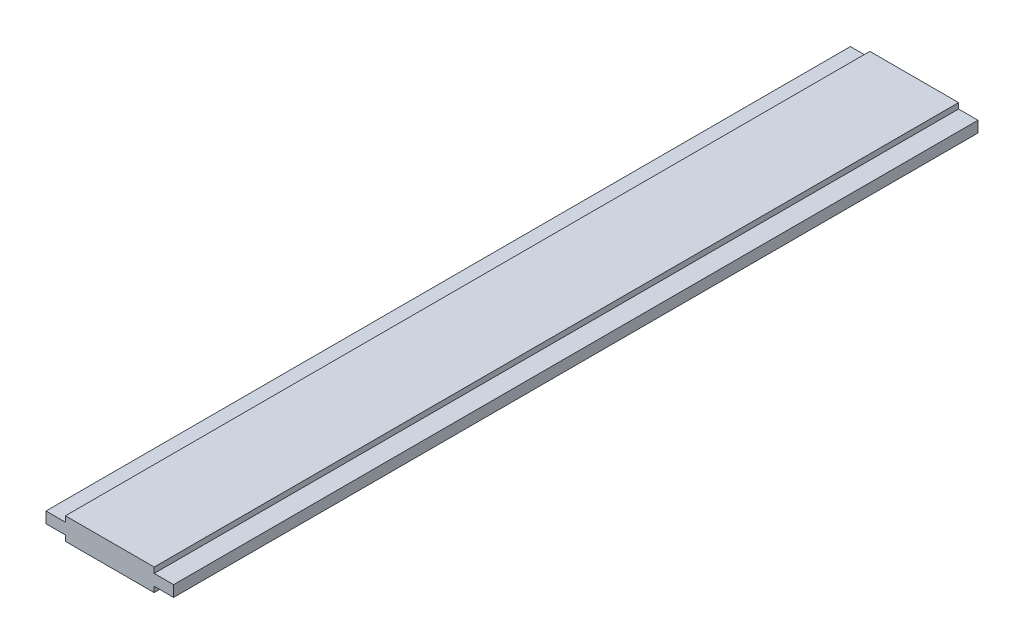
ISO-10303-21;
HEADER;
FILE_DESCRIPTION(('STEP AP214'),'2;1');
FILE_NAME('part.step','',(''),(''),'','','');
FILE_SCHEMA(('AUTOMOTIVE_DESIGN { 1 0 10303 214 1 1 1 1 }'));
ENDSEC;
DATA;
#1=APPLICATION_CONTEXT('core data for automotive mechanical design processes');
#2=APPLICATION_PROTOCOL_DEFINITION('international standard','automotive_design',2000,#1);
#3=PRODUCT_CONTEXT('',#1,'mechanical');
#4=PRODUCT('Part','Part','',(#3));
#5=PRODUCT_RELATED_PRODUCT_CATEGORY('part','',(#4));
#6=PRODUCT_DEFINITION_FORMATION('','',#4);
#7=PRODUCT_DEFINITION_CONTEXT('part definition',#1,'design');
#8=PRODUCT_DEFINITION('design','',#6,#7);
#9=PRODUCT_DEFINITION_SHAPE('','',#8);
#10=(LENGTH_UNIT() NAMED_UNIT(*) SI_UNIT(.MILLI.,.METRE.));
#11=(NAMED_UNIT(*) PLANE_ANGLE_UNIT() SI_UNIT($,.RADIAN.));
#12=(NAMED_UNIT(*) SI_UNIT($,.STERADIAN.) SOLID_ANGLE_UNIT());
#13=UNCERTAINTY_MEASURE_WITH_UNIT(LENGTH_MEASURE(1.E-05),#10,'distance_accuracy_value','');
#14=(GEOMETRIC_REPRESENTATION_CONTEXT(3) GLOBAL_UNCERTAINTY_ASSIGNED_CONTEXT((#13)) GLOBAL_UNIT_ASSIGNED_CONTEXT((#10,
#11,#12)) REPRESENTATION_CONTEXT('',''));
#15=CARTESIAN_POINT('',(0.,0.,0.));
#16=DIRECTION('',(0.,0.,1.));
#17=DIRECTION('',(1.,0.,0.));
#18=AXIS2_PLACEMENT_3D('',#15,#16,#17);
#19=CARTESIAN_POINT('',(-4.,17.5,72.5));
#20=DIRECTION('',(1.,0.,0.));
#21=DIRECTION('',(0.,1.,0.));
#22=AXIS2_PLACEMENT_3D('',#19,#20,#21);
#23=PLANE('',#22);
#24=DIRECTION('',(0.,-1.,0.));
#25=VECTOR('',#24,1.);
#26=CARTESIAN_POINT('',(-4.,17.5,0.));
#27=LINE('',#26,#25);
#28=CARTESIAN_POINT('',(-4.,17.5,0.));
#29=VERTEX_POINT('',#28);
#30=CARTESIAN_POINT('',(-4.,17.,0.));
#31=VERTEX_POINT('',#30);
#32=EDGE_CURVE('E154',#29,#31,#27,.T.);
#33=ORIENTED_EDGE('',*,*,#32,.T.);
#34=DIRECTION('',(0.,0.,-1.));
#35=VECTOR('',#34,1.);
#36=CARTESIAN_POINT('',(-4.,17.,72.5));
#37=LINE('',#36,#35);
#38=CARTESIAN_POINT('',(-4.,17.,72.5));
#39=VERTEX_POINT('',#38);
#40=EDGE_CURVE('E11',#39,#31,#37,.T.);
#41=ORIENTED_EDGE('',*,*,#40,.F.);
#42=DIRECTION('',(0.,-1.,0.));
#43=VECTOR('',#42,1.);
#44=CARTESIAN_POINT('',(-4.,17.5,72.5));
#45=LINE('',#44,#43);
#46=CARTESIAN_POINT('',(-4.,17.5,72.5));
#47=VERTEX_POINT('',#46);
#48=EDGE_CURVE('E184',#47,#39,#45,.T.);
#49=ORIENTED_EDGE('',*,*,#48,.F.);
#50=DIRECTION('',(0.,0.,-1.));
#51=VECTOR('',#50,1.);
#52=CARTESIAN_POINT('',(-4.,17.5,72.5));
#53=LINE('',#52,#51);
#54=EDGE_CURVE('E153',#47,#29,#53,.T.);
#55=ORIENTED_EDGE('',*,*,#54,.T.);
#56=EDGE_LOOP('',(#33,#41,#49,#55));
#57=FACE_BOUND('',#56,.T.);
#58=ADVANCED_FACE('F32',(#57),#23,.F.);
#59=CARTESIAN_POINT('',(-4.,17.,72.5));
#60=DIRECTION('',(0.,1.,0.));
#61=DIRECTION('',(0.,0.,1.));
#62=AXIS2_PLACEMENT_3D('',#59,#60,#61);
#63=PLANE('',#62);
#64=DIRECTION('',(1.,0.,0.));
#65=VECTOR('',#64,1.);
#66=CARTESIAN_POINT('',(-4.,17.,0.));
#67=LINE('',#66,#65);
#68=CARTESIAN_POINT('',(4.,17.,0.));
#69=VERTEX_POINT('',#68);
#70=EDGE_CURVE('E157',#31,#69,#67,.T.);
#71=ORIENTED_EDGE('',*,*,#70,.T.);
#72=DIRECTION('',(0.,0.,-1.));
#73=VECTOR('',#72,1.);
#74=CARTESIAN_POINT('',(4.,17.,72.5));
#75=LINE('',#74,#73);
#76=CARTESIAN_POINT('',(4.,17.,72.5));
#77=VERTEX_POINT('',#76);
#78=EDGE_CURVE('E40',#77,#69,#75,.T.);
#79=ORIENTED_EDGE('',*,*,#78,.F.);
#80=DIRECTION('',(1.,0.,0.));
#81=VECTOR('',#80,1.);
#82=CARTESIAN_POINT('',(-4.,17.,72.5));
#83=LINE('',#82,#81);
#84=EDGE_CURVE('E102',#39,#77,#83,.T.);
#85=ORIENTED_EDGE('',*,*,#84,.F.);
#86=ORIENTED_EDGE('',*,*,#40,.T.);
#87=EDGE_LOOP('',(#71,#79,#85,#86));
#88=FACE_BOUND('',#87,.T.);
#89=ADVANCED_FACE('F205',(#88),#63,.F.);
#90=CARTESIAN_POINT('',(4.,17.5,72.5));
#91=DIRECTION('',(1.,0.,0.));
#92=DIRECTION('',(0.,1.,0.));
#93=AXIS2_PLACEMENT_3D('',#90,#91,#92);
#94=PLANE('',#93);
#95=DIRECTION('',(0.,-1.,0.));
#96=VECTOR('',#95,1.);
#97=CARTESIAN_POINT('',(4.,17.5,0.));
#98=LINE('',#97,#96);
#99=CARTESIAN_POINT('',(4.,17.5,0.));
#100=VERTEX_POINT('',#99);
#101=EDGE_CURVE('E160',#100,#69,#98,.T.);
#102=ORIENTED_EDGE('',*,*,#101,.F.);
#103=DIRECTION('',(0.,0.,-1.));
#104=VECTOR('',#103,1.);
#105=CARTESIAN_POINT('',(4.,17.5,72.5));
#106=LINE('',#105,#104);
#107=CARTESIAN_POINT('',(4.,17.5,72.5));
#108=VERTEX_POINT('',#107);
#109=EDGE_CURVE('E198',#108,#100,#106,.T.);
#110=ORIENTED_EDGE('',*,*,#109,.F.);
#111=DIRECTION('',(0.,-1.,0.));
#112=VECTOR('',#111,1.);
#113=CARTESIAN_POINT('',(4.,17.5,72.5));
#114=LINE('',#113,#112);
#115=EDGE_CURVE('E204',#108,#77,#114,.T.);
#116=ORIENTED_EDGE('',*,*,#115,.T.);
#117=ORIENTED_EDGE('',*,*,#78,.T.);
#118=EDGE_LOOP('',(#102,#110,#116,#117));
#119=FACE_BOUND('',#118,.T.);
#120=ADVANCED_FACE('F202',(#119),#94,.T.);
#121=CARTESIAN_POINT('',(4.,17.5,72.5));
#122=DIRECTION('',(0.,1.,0.));
#123=DIRECTION('',(0.,0.,1.));
#124=AXIS2_PLACEMENT_3D('',#121,#122,#123);
#125=PLANE('',#124);
#126=DIRECTION('',(1.,0.,0.));
#127=VECTOR('',#126,1.);
#128=CARTESIAN_POINT('',(4.,17.5,0.));
#129=LINE('',#128,#127);
#130=CARTESIAN_POINT('',(5.75000000000004,17.5,0.));
#131=VERTEX_POINT('',#130);
#132=EDGE_CURVE('E163',#100,#131,#129,.T.);
#133=ORIENTED_EDGE('',*,*,#132,.T.);
#134=DIRECTION('',(0.,0.,-1.));
#135=VECTOR('',#134,1.);
#136=CARTESIAN_POINT('',(5.75000000000004,17.5,72.5));
#137=LINE('',#136,#135);
#138=CARTESIAN_POINT('',(5.75000000000004,17.5,72.5));
#139=VERTEX_POINT('',#138);
#140=EDGE_CURVE('E196',#139,#131,#137,.T.);
#141=ORIENTED_EDGE('',*,*,#140,.F.);
#142=DIRECTION('',(1.,0.,0.));
#143=VECTOR('',#142,1.);
#144=CARTESIAN_POINT('',(4.,17.5,72.5));
#145=LINE('',#144,#143);
#146=EDGE_CURVE('E217',#108,#139,#145,.T.);
#147=ORIENTED_EDGE('',*,*,#146,.F.);
#148=ORIENTED_EDGE('',*,*,#109,.T.);
#149=EDGE_LOOP('',(#133,#141,#147,#148));
#150=FACE_BOUND('',#149,.T.);
#151=ADVANCED_FACE('F214',(#150),#125,.F.);
#152=CARTESIAN_POINT('',(5.75000000000004,18.5,72.5));
#153=DIRECTION('',(1.,0.,0.));
#154=DIRECTION('',(0.,0.,-1.));
#155=AXIS2_PLACEMENT_3D('',#152,#153,#154);
#156=PLANE('',#155);
#157=DIRECTION('',(0.,-1.,0.));
#158=VECTOR('',#157,1.);
#159=CARTESIAN_POINT('',(5.75000000000004,18.5,0.));
#160=LINE('',#159,#158);
#161=CARTESIAN_POINT('',(5.75000000000004,18.5,0.));
#162=VERTEX_POINT('',#161);
#163=EDGE_CURVE('E166',#162,#131,#160,.T.);
#164=ORIENTED_EDGE('',*,*,#163,.F.);
#165=DIRECTION('',(0.,0.,-1.));
#166=VECTOR('',#165,1.);
#167=CARTESIAN_POINT('',(5.75000000000004,18.5,72.5));
#168=LINE('',#167,#166);
#169=CARTESIAN_POINT('',(5.75000000000004,18.5,72.5));
#170=VERTEX_POINT('',#169);
#171=EDGE_CURVE('E194',#170,#162,#168,.T.);
#172=ORIENTED_EDGE('',*,*,#171,.F.);
#173=DIRECTION('',(0.,-1.,0.));
#174=VECTOR('',#173,1.);
#175=CARTESIAN_POINT('',(5.75000000000004,18.5,72.5));
#176=LINE('',#175,#174);
#177=EDGE_CURVE('E219',#170,#139,#176,.T.);
#178=ORIENTED_EDGE('',*,*,#177,.T.);
#179=ORIENTED_EDGE('',*,*,#140,.T.);
#180=EDGE_LOOP('',(#164,#172,#178,#179));
#181=FACE_BOUND('',#180,.T.);
#182=ADVANCED_FACE('F319',(#181),#156,.T.);
#183=CARTESIAN_POINT('',(4.,18.5,72.5));
#184=DIRECTION('',(0.,1.,0.));
#185=DIRECTION('',(0.,0.,1.));
#186=AXIS2_PLACEMENT_3D('',#183,#184,#185);
#187=PLANE('',#186);
#188=DIRECTION('',(1.,0.,0.));
#189=VECTOR('',#188,1.);
#190=CARTESIAN_POINT('',(4.,18.5,0.));
#191=LINE('',#190,#189);
#192=CARTESIAN_POINT('',(4.,18.5,0.));
#193=VERTEX_POINT('',#192);
#194=EDGE_CURVE('E169',#193,#162,#191,.T.);
#195=ORIENTED_EDGE('',*,*,#194,.F.);
#196=DIRECTION('',(0.,0.,-1.));
#197=VECTOR('',#196,1.);
#198=CARTESIAN_POINT('',(4.,18.5,72.5));
#199=LINE('',#198,#197);
#200=CARTESIAN_POINT('',(4.,18.5,72.5));
#201=VERTEX_POINT('',#200);
#202=EDGE_CURVE('E192',#201,#193,#199,.T.);
#203=ORIENTED_EDGE('',*,*,#202,.F.);
#204=DIRECTION('',(1.,0.,0.));
#205=VECTOR('',#204,1.);
#206=CARTESIAN_POINT('',(4.,18.5,72.5));
#207=LINE('',#206,#205);
#208=EDGE_CURVE('E226',#201,#170,#207,.T.);
#209=ORIENTED_EDGE('',*,*,#208,.T.);
#210=ORIENTED_EDGE('',*,*,#171,.T.);
#211=EDGE_LOOP('',(#195,#203,#209,#210));
#212=FACE_BOUND('',#211,.T.);
#213=ADVANCED_FACE('F310',(#212),#187,.T.);
#214=CARTESIAN_POINT('',(4.,19.,72.5));
#215=DIRECTION('',(1.,0.,0.));
#216=DIRECTION('',(0.,0.,-1.));
#217=AXIS2_PLACEMENT_3D('',#214,#215,#216);
#218=PLANE('',#217);
#219=DIRECTION('',(0.,-1.,0.));
#220=VECTOR('',#219,1.);
#221=CARTESIAN_POINT('',(4.,19.,0.));
#222=LINE('',#221,#220);
#223=CARTESIAN_POINT('',(4.,19.,0.));
#224=VERTEX_POINT('',#223);
#225=EDGE_CURVE('E172',#224,#193,#222,.T.);
#226=ORIENTED_EDGE('',*,*,#225,.F.);
#227=DIRECTION('',(0.,0.,-1.));
#228=VECTOR('',#227,1.);
#229=CARTESIAN_POINT('',(4.,19.,72.5));
#230=LINE('',#229,#228);
#231=CARTESIAN_POINT('',(4.,19.,72.5));
#232=VERTEX_POINT('',#231);
#233=EDGE_CURVE('E190',#232,#224,#230,.T.);
#234=ORIENTED_EDGE('',*,*,#233,.F.);
#235=DIRECTION('',(0.,-1.,0.));
#236=VECTOR('',#235,1.);
#237=CARTESIAN_POINT('',(4.,19.,72.5));
#238=LINE('',#237,#236);
#239=EDGE_CURVE('E229',#232,#201,#238,.T.);
#240=ORIENTED_EDGE('',*,*,#239,.T.);
#241=ORIENTED_EDGE('',*,*,#202,.T.);
#242=EDGE_LOOP('',(#226,#234,#240,#241));
#243=FACE_BOUND('',#242,.T.);
#244=ADVANCED_FACE('F239',(#243),#218,.T.);
#245=CARTESIAN_POINT('',(-4.,19.,72.5));
#246=DIRECTION('',(0.,1.,0.));
#247=DIRECTION('',(0.,0.,1.));
#248=AXIS2_PLACEMENT_3D('',#245,#246,#247);
#249=PLANE('',#248);
#250=DIRECTION('',(1.,0.,0.));
#251=VECTOR('',#250,1.);
#252=CARTESIAN_POINT('',(-4.,19.,0.));
#253=LINE('',#252,#251);
#254=CARTESIAN_POINT('',(-4.,19.,0.));
#255=VERTEX_POINT('',#254);
#256=EDGE_CURVE('E175',#255,#224,#253,.T.);
#257=ORIENTED_EDGE('',*,*,#256,.F.);
#258=DIRECTION('',(0.,0.,-1.));
#259=VECTOR('',#258,1.);
#260=CARTESIAN_POINT('',(-4.,19.,72.5));
#261=LINE('',#260,#259);
#262=CARTESIAN_POINT('',(-4.,19.,72.5));
#263=VERTEX_POINT('',#262);
#264=EDGE_CURVE('E188',#263,#255,#261,.T.);
#265=ORIENTED_EDGE('',*,*,#264,.F.);
#266=DIRECTION('',(1.,0.,0.));
#267=VECTOR('',#266,1.);
#268=CARTESIAN_POINT('',(-4.,19.,72.5));
#269=LINE('',#268,#267);
#270=EDGE_CURVE('E148',#263,#232,#269,.T.);
#271=ORIENTED_EDGE('',*,*,#270,.T.);
#272=ORIENTED_EDGE('',*,*,#233,.T.);
#273=EDGE_LOOP('',(#257,#265,#271,#272));
#274=FACE_BOUND('',#273,.T.);
#275=ADVANCED_FACE('F234',(#274),#249,.T.);
#276=CARTESIAN_POINT('',(-4.,19.,72.5));
#277=DIRECTION('',(1.,0.,0.));
#278=DIRECTION('',(0.,0.,-1.));
#279=AXIS2_PLACEMENT_3D('',#276,#277,#278);
#280=PLANE('',#279);
#281=DIRECTION('',(0.,-1.,0.));
#282=VECTOR('',#281,1.);
#283=CARTESIAN_POINT('',(-4.,19.,0.));
#284=LINE('',#283,#282);
#285=CARTESIAN_POINT('',(-4.,18.5,0.));
#286=VERTEX_POINT('',#285);
#287=EDGE_CURVE('E178',#255,#286,#284,.T.);
#288=ORIENTED_EDGE('',*,*,#287,.T.);
#289=DIRECTION('',(0.,0.,-1.));
#290=VECTOR('',#289,1.);
#291=CARTESIAN_POINT('',(-4.,18.5,72.5));
#292=LINE('',#291,#290);
#293=CARTESIAN_POINT('',(-4.,18.5,72.5));
#294=VERTEX_POINT('',#293);
#295=EDGE_CURVE('E136',#294,#286,#292,.T.);
#296=ORIENTED_EDGE('',*,*,#295,.F.);
#297=DIRECTION('',(0.,-1.,0.));
#298=VECTOR('',#297,1.);
#299=CARTESIAN_POINT('',(-4.,19.,72.5));
#300=LINE('',#299,#298);
#301=EDGE_CURVE('E145',#263,#294,#300,.T.);
#302=ORIENTED_EDGE('',*,*,#301,.F.);
#303=ORIENTED_EDGE('',*,*,#264,.T.);
#304=EDGE_LOOP('',(#288,#296,#302,#303));
#305=FACE_BOUND('',#304,.T.);
#306=ADVANCED_FACE('F243',(#305),#280,.F.);
#307=CARTESIAN_POINT('',(-5.74999999999996,18.5,72.5));
#308=DIRECTION('',(0.,1.,0.));
#309=DIRECTION('',(0.,0.,1.));
#310=AXIS2_PLACEMENT_3D('',#307,#308,#309);
#311=PLANE('',#310);
#312=DIRECTION('',(1.,0.,0.));
#313=VECTOR('',#312,1.);
#314=CARTESIAN_POINT('',(-5.74999999999996,18.5,0.));
#315=LINE('',#314,#313);
#316=CARTESIAN_POINT('',(-5.74999999999996,18.5,0.));
#317=VERTEX_POINT('',#316);
#318=EDGE_CURVE('E135',#317,#286,#315,.T.);
#319=ORIENTED_EDGE('',*,*,#318,.F.);
#320=DIRECTION('',(0.,0.,-1.));
#321=VECTOR('',#320,1.);
#322=CARTESIAN_POINT('',(-5.74999999999996,18.5,72.5));
#323=LINE('',#322,#321);
#324=CARTESIAN_POINT('',(-5.74999999999996,18.5,72.5));
#325=VERTEX_POINT('',#324);
#326=EDGE_CURVE('E129',#325,#317,#323,.T.);
#327=ORIENTED_EDGE('',*,*,#326,.F.);
#328=DIRECTION('',(1.,0.,0.));
#329=VECTOR('',#328,1.);
#330=CARTESIAN_POINT('',(-5.74999999999996,18.5,72.5));
#331=LINE('',#330,#329);
#332=EDGE_CURVE('E133',#325,#294,#331,.T.);
#333=ORIENTED_EDGE('',*,*,#332,.T.);
#334=ORIENTED_EDGE('',*,*,#295,.T.);
#335=EDGE_LOOP('',(#319,#327,#333,#334));
#336=FACE_BOUND('',#335,.T.);
#337=ADVANCED_FACE('F131',(#336),#311,.T.);
#338=CARTESIAN_POINT('',(-5.74999999999996,18.5,72.5));
#339=DIRECTION('',(1.,0.,0.));
#340=DIRECTION('',(0.,1.,0.));
#341=AXIS2_PLACEMENT_3D('',#338,#339,#340);
#342=PLANE('',#341);
#343=DIRECTION('',(0.,-1.,0.));
#344=VECTOR('',#343,1.);
#345=CARTESIAN_POINT('',(-5.74999999999996,18.5,0.));
#346=LINE('',#345,#344);
#347=CARTESIAN_POINT('',(-5.74999999999996,17.5,0.));
#348=VERTEX_POINT('',#347);
#349=EDGE_CURVE('E88',#317,#348,#346,.T.);
#350=ORIENTED_EDGE('',*,*,#349,.T.);
#351=DIRECTION('',(0.,0.,-1.));
#352=VECTOR('',#351,1.);
#353=CARTESIAN_POINT('',(-5.74999999999996,17.5,72.5));
#354=LINE('',#353,#352);
#355=CARTESIAN_POINT('',(-5.74999999999996,17.5,72.5));
#356=VERTEX_POINT('',#355);
#357=EDGE_CURVE('E137',#356,#348,#354,.T.);
#358=ORIENTED_EDGE('',*,*,#357,.F.);
#359=DIRECTION('',(0.,-1.,0.));
#360=VECTOR('',#359,1.);
#361=CARTESIAN_POINT('',(-5.74999999999996,18.5,72.5));
#362=LINE('',#361,#360);
#363=EDGE_CURVE('E139',#325,#356,#362,.T.);
#364=ORIENTED_EDGE('',*,*,#363,.F.);
#365=ORIENTED_EDGE('',*,*,#326,.T.);
#366=EDGE_LOOP('',(#350,#358,#364,#365));
#367=FACE_BOUND('',#366,.T.);
#368=ADVANCED_FACE('F140',(#367),#342,.F.);
#369=CARTESIAN_POINT('',(-5.74999999999996,17.5,72.5));
#370=DIRECTION('',(0.,1.,0.));
#371=DIRECTION('',(0.,0.,1.));
#372=AXIS2_PLACEMENT_3D('',#369,#370,#371);
#373=PLANE('',#372);
#374=DIRECTION('',(1.,0.,0.));
#375=VECTOR('',#374,1.);
#376=CARTESIAN_POINT('',(-5.74999999999996,17.5,0.));
#377=LINE('',#376,#375);
#378=EDGE_CURVE('E94',#348,#29,#377,.T.);
#379=ORIENTED_EDGE('',*,*,#378,.T.);
#380=ORIENTED_EDGE('',*,*,#54,.F.);
#381=DIRECTION('',(1.,0.,0.));
#382=VECTOR('',#381,1.);
#383=CARTESIAN_POINT('',(-5.74999999999996,17.5,72.5));
#384=LINE('',#383,#382);
#385=EDGE_CURVE('E48',#356,#47,#384,.T.);
#386=ORIENTED_EDGE('',*,*,#385,.F.);
#387=ORIENTED_EDGE('',*,*,#357,.T.);
#388=EDGE_LOOP('',(#379,#380,#386,#387));
#389=FACE_BOUND('',#388,.T.);
#390=ADVANCED_FACE('F258',(#389),#373,.F.);
#391=CARTESIAN_POINT('',(0.,0.,72.5));
#392=DIRECTION('',(0.,0.,1.));
#393=DIRECTION('',(1.,0.,0.));
#394=AXIS2_PLACEMENT_3D('',#391,#392,#393);
#395=PLANE('',#394);
#396=ORIENTED_EDGE('',*,*,#48,.T.);
#397=ORIENTED_EDGE('',*,*,#84,.T.);
#398=ORIENTED_EDGE('',*,*,#115,.F.);
#399=ORIENTED_EDGE('',*,*,#146,.T.);
#400=ORIENTED_EDGE('',*,*,#177,.F.);
#401=ORIENTED_EDGE('',*,*,#208,.F.);
#402=ORIENTED_EDGE('',*,*,#239,.F.);
#403=ORIENTED_EDGE('',*,*,#270,.F.);
#404=ORIENTED_EDGE('',*,*,#301,.T.);
#405=ORIENTED_EDGE('',*,*,#332,.F.);
#406=ORIENTED_EDGE('',*,*,#363,.T.);
#407=ORIENTED_EDGE('',*,*,#385,.T.);
#408=EDGE_LOOP('',(#396,#397,#398,#399,#400,#401,#402,#403,#404,#405,#406,#407));
#409=FACE_BOUND('',#408,.T.);
#410=ADVANCED_FACE('F142',(#409),#395,.T.);
#411=CARTESIAN_POINT('',(0.,0.,0.));
#412=DIRECTION('',(0.,0.,1.));
#413=DIRECTION('',(1.,0.,0.));
#414=AXIS2_PLACEMENT_3D('',#411,#412,#413);
#415=PLANE('',#414);
#416=ORIENTED_EDGE('',*,*,#32,.F.);
#417=ORIENTED_EDGE('',*,*,#378,.F.);
#418=ORIENTED_EDGE('',*,*,#349,.F.);
#419=ORIENTED_EDGE('',*,*,#318,.T.);
#420=ORIENTED_EDGE('',*,*,#287,.F.);
#421=ORIENTED_EDGE('',*,*,#256,.T.);
#422=ORIENTED_EDGE('',*,*,#225,.T.);
#423=ORIENTED_EDGE('',*,*,#194,.T.);
#424=ORIENTED_EDGE('',*,*,#163,.T.);
#425=ORIENTED_EDGE('',*,*,#132,.F.);
#426=ORIENTED_EDGE('',*,*,#101,.T.);
#427=ORIENTED_EDGE('',*,*,#70,.F.);
#428=EDGE_LOOP('',(#416,#417,#418,#419,#420,#421,#422,#423,#424,#425,#426,#427));
#429=FACE_BOUND('',#428,.T.);
#430=ADVANCED_FACE('F210',(#429),#415,.F.);
#431=CLOSED_SHELL('',(#58,#89,#120,#151,#182,#213,#244,#275,#306,#337,#368,#390,#410,#430));
#432=MANIFOLD_SOLID_BREP('B2',#431);
#433=ADVANCED_BREP_SHAPE_REPRESENTATION('',(#18,#432),#14);
#434=SHAPE_DEFINITION_REPRESENTATION(#9,#433);
ENDSEC;
END-ISO-10303-21;
